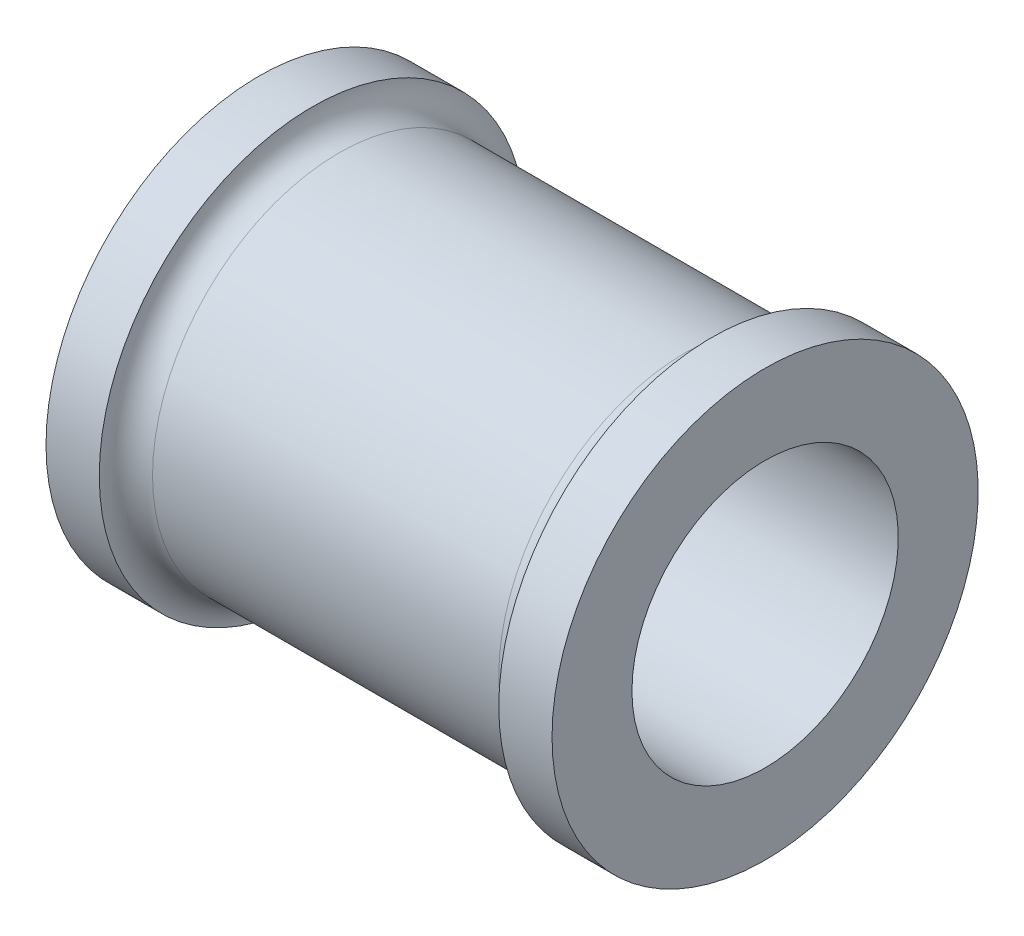
ISO-10303-21;
HEADER;
FILE_DESCRIPTION(('STEP AP214'),'2;1');
FILE_NAME('part.step','',(''),(''),'','','');
FILE_SCHEMA(('AUTOMOTIVE_DESIGN { 1 0 10303 214 1 1 1 1 }'));
ENDSEC;
DATA;
#1=APPLICATION_CONTEXT('core data for automotive mechanical design processes');
#2=APPLICATION_PROTOCOL_DEFINITION('international standard','automotive_design',2000,#1);
#3=PRODUCT_CONTEXT('',#1,'mechanical');
#4=PRODUCT('Part','Part','',(#3));
#5=PRODUCT_RELATED_PRODUCT_CATEGORY('part','',(#4));
#6=PRODUCT_DEFINITION_FORMATION('','',#4);
#7=PRODUCT_DEFINITION_CONTEXT('part definition',#1,'design');
#8=PRODUCT_DEFINITION('design','',#6,#7);
#9=PRODUCT_DEFINITION_SHAPE('','',#8);
#10=(LENGTH_UNIT() NAMED_UNIT(*) SI_UNIT(.MILLI.,.METRE.));
#11=(NAMED_UNIT(*) PLANE_ANGLE_UNIT() SI_UNIT($,.RADIAN.));
#12=(NAMED_UNIT(*) SI_UNIT($,.STERADIAN.) SOLID_ANGLE_UNIT());
#13=UNCERTAINTY_MEASURE_WITH_UNIT(LENGTH_MEASURE(1.E-05),#10,'distance_accuracy_value','');
#14=(GEOMETRIC_REPRESENTATION_CONTEXT(3) GLOBAL_UNCERTAINTY_ASSIGNED_CONTEXT((#13)) GLOBAL_UNIT_ASSIGNED_CONTEXT((#10,
#11,#12)) REPRESENTATION_CONTEXT('',''));
#15=CARTESIAN_POINT('',(0.,0.,0.));
#16=DIRECTION('',(0.,0.,1.));
#17=DIRECTION('',(1.,0.,0.));
#18=AXIS2_PLACEMENT_3D('',#15,#16,#17);
#19=CARTESIAN_POINT('',(0.,0.,0.));
#20=DIRECTION('',(-1.,0.,0.));
#21=DIRECTION('',(0.,0.,1.));
#22=AXIS2_PLACEMENT_3D('',#19,#20,#21);
#23=CYLINDRICAL_SURFACE('',#22,8.);
#24=CARTESIAN_POINT('',(-2.,0.,0.));
#25=DIRECTION('',(-1.,0.,0.));
#26=DIRECTION('',(0.,0.,1.));
#27=AXIS2_PLACEMENT_3D('',#24,#25,#26);
#28=CIRCLE('',#27,8.);
#29=CARTESIAN_POINT('',(-2.,0.,8.));
#30=VERTEX_POINT('',#29);
#31=EDGE_CURVE('E61',#30,#30,#28,.T.);
#32=ORIENTED_EDGE('',*,*,#31,.F.);
#33=EDGE_LOOP('',(#32));
#34=FACE_BOUND('',#33,.T.);
#35=CARTESIAN_POINT('',(0.,0.,0.));
#36=DIRECTION('',(-1.,0.,0.));
#37=DIRECTION('',(0.,0.,1.));
#38=AXIS2_PLACEMENT_3D('',#35,#36,#37);
#39=CIRCLE('',#38,8.);
#40=CARTESIAN_POINT('',(0.,0.,8.));
#41=VERTEX_POINT('',#40);
#42=EDGE_CURVE('E57',#41,#41,#39,.T.);
#43=ORIENTED_EDGE('',*,*,#42,.T.);
#44=EDGE_LOOP('',(#43));
#45=FACE_BOUND('',#44,.T.);
#46=ADVANCED_FACE('F46',(#34,#45),#23,.T.);
#47=CARTESIAN_POINT('',(-2.,0.,-5.));
#48=DIRECTION('',(1.,0.,0.));
#49=DIRECTION('',(0.,0.,-1.));
#50=AXIS2_PLACEMENT_3D('',#47,#48,#49);
#51=PLANE('',#50);
#52=CARTESIAN_POINT('',(-2.,0.,0.));
#53=DIRECTION('',(-1.,0.,0.));
#54=DIRECTION('',(0.,0.,1.));
#55=AXIS2_PLACEMENT_3D('',#52,#53,#54);
#56=CIRCLE('',#55,5.);
#57=CARTESIAN_POINT('',(-2.,0.,5.));
#58=VERTEX_POINT('',#57);
#59=EDGE_CURVE('E66',#58,#58,#56,.T.);
#60=ORIENTED_EDGE('',*,*,#59,.F.);
#61=EDGE_LOOP('',(#60));
#62=FACE_BOUND('',#61,.T.);
#63=ORIENTED_EDGE('',*,*,#31,.T.);
#64=EDGE_LOOP('',(#63));
#65=FACE_BOUND('',#64,.T.);
#66=ADVANCED_FACE('F97',(#62,#65),#51,.F.);
#67=CARTESIAN_POINT('',(0.,0.,0.));
#68=DIRECTION('',(-1.,0.,0.));
#69=DIRECTION('',(0.,0.,1.));
#70=AXIS2_PLACEMENT_3D('',#67,#68,#69);
#71=CYLINDRICAL_SURFACE('',#70,5.);
#72=CARTESIAN_POINT('',(17.,0.,0.));
#73=DIRECTION('',(-1.,0.,0.));
#74=DIRECTION('',(0.,0.,1.));
#75=AXIS2_PLACEMENT_3D('',#72,#73,#74);
#76=CIRCLE('',#75,5.);
#77=CARTESIAN_POINT('',(17.,0.,5.));
#78=VERTEX_POINT('',#77);
#79=EDGE_CURVE('E69',#78,#78,#76,.T.);
#80=ORIENTED_EDGE('',*,*,#79,.F.);
#81=EDGE_LOOP('',(#80));
#82=FACE_BOUND('',#81,.T.);
#83=ORIENTED_EDGE('',*,*,#59,.T.);
#84=EDGE_LOOP('',(#83));
#85=FACE_BOUND('',#84,.T.);
#86=ADVANCED_FACE('F91',(#82,#85),#71,.F.);
#87=CARTESIAN_POINT('',(17.,0.,-8.));
#88=DIRECTION('',(-1.,0.,0.));
#89=DIRECTION('',(0.,0.,1.));
#90=AXIS2_PLACEMENT_3D('',#87,#88,#89);
#91=PLANE('',#90);
#92=CARTESIAN_POINT('',(17.,0.,0.));
#93=DIRECTION('',(-1.,0.,0.));
#94=DIRECTION('',(0.,0.,1.));
#95=AXIS2_PLACEMENT_3D('',#92,#93,#94);
#96=CIRCLE('',#95,8.);
#97=CARTESIAN_POINT('',(17.,0.,8.));
#98=VERTEX_POINT('',#97);
#99=EDGE_CURVE('E72',#98,#98,#96,.T.);
#100=ORIENTED_EDGE('',*,*,#99,.F.);
#101=EDGE_LOOP('',(#100));
#102=FACE_BOUND('',#101,.T.);
#103=ORIENTED_EDGE('',*,*,#79,.T.);
#104=EDGE_LOOP('',(#103));
#105=FACE_BOUND('',#104,.T.);
#106=ADVANCED_FACE('F85',(#102,#105),#91,.F.);
#107=CARTESIAN_POINT('',(0.,0.,0.));
#108=DIRECTION('',(-1.,0.,0.));
#109=DIRECTION('',(0.,0.,1.));
#110=AXIS2_PLACEMENT_3D('',#107,#108,#109);
#111=CYLINDRICAL_SURFACE('',#110,8.);
#112=CARTESIAN_POINT('',(15.,0.,0.));
#113=DIRECTION('',(-1.,0.,0.));
#114=DIRECTION('',(0.,0.,1.));
#115=AXIS2_PLACEMENT_3D('',#112,#113,#114);
#116=CIRCLE('',#115,8.);
#117=CARTESIAN_POINT('',(15.,0.,8.));
#118=VERTEX_POINT('',#117);
#119=EDGE_CURVE('E75',#118,#118,#116,.T.);
#120=ORIENTED_EDGE('',*,*,#119,.F.);
#121=EDGE_LOOP('',(#120));
#122=FACE_BOUND('',#121,.T.);
#123=ORIENTED_EDGE('',*,*,#99,.T.);
#124=EDGE_LOOP('',(#123));
#125=FACE_BOUND('',#124,.T.);
#126=ADVANCED_FACE('F81',(#122,#125),#111,.T.);
#127=CARTESIAN_POINT('',(0.,0.,0.));
#128=DIRECTION('',(-1.,0.,0.));
#129=DIRECTION('',(0.,0.,1.));
#130=AXIS2_PLACEMENT_3D('',#127,#128,#129);
#131=CYLINDRICAL_SURFACE('',#130,7.);
#132=CARTESIAN_POINT('',(1.,0.,0.));
#133=DIRECTION('',(-1.,0.,0.));
#134=DIRECTION('',(0.,0.,1.));
#135=AXIS2_PLACEMENT_3D('',#132,#133,#134);
#136=CIRCLE('',#135,7.);
#137=CARTESIAN_POINT('',(1.,0.,7.));
#138=VERTEX_POINT('',#137);
#139=EDGE_CURVE('E12',#138,#138,#136,.F.);
#140=ORIENTED_EDGE('',*,*,#139,.T.);
#141=EDGE_LOOP('',(#140));
#142=FACE_BOUND('',#141,.T.);
#143=CARTESIAN_POINT('',(14.,0.,0.));
#144=DIRECTION('',(1.,0.,0.));
#145=DIRECTION('',(0.,0.,-1.));
#146=AXIS2_PLACEMENT_3D('',#143,#144,#145);
#147=CIRCLE('',#146,7.);
#148=CARTESIAN_POINT('',(14.,0.,-7.));
#149=VERTEX_POINT('',#148);
#150=EDGE_CURVE('E53',#149,#149,#147,.F.);
#151=ORIENTED_EDGE('',*,*,#150,.T.);
#152=EDGE_LOOP('',(#151));
#153=FACE_BOUND('',#152,.T.);
#154=ADVANCED_FACE('F84',(#142,#153),#131,.T.);
#155=CARTESIAN_POINT('',(1.,0.,0.));
#156=DIRECTION('',(-1.,0.,0.));
#157=DIRECTION('',(0.,0.,1.));
#158=AXIS2_PLACEMENT_3D('',#155,#156,#157);
#159=TOROIDAL_SURFACE('',#158,8.,1.);
#160=ORIENTED_EDGE('',*,*,#139,.F.);
#161=EDGE_LOOP('',(#160));
#162=FACE_BOUND('',#161,.T.);
#163=ORIENTED_EDGE('',*,*,#42,.F.);
#164=EDGE_LOOP('',(#163));
#165=FACE_BOUND('',#164,.T.);
#166=ADVANCED_FACE('F111',(#162,#165),#159,.F.);
#167=CARTESIAN_POINT('',(14.,0.,0.));
#168=DIRECTION('',(1.,0.,0.));
#169=DIRECTION('',(0.,0.,-1.));
#170=AXIS2_PLACEMENT_3D('',#167,#168,#169);
#171=TOROIDAL_SURFACE('',#170,8.,1.);
#172=ORIENTED_EDGE('',*,*,#119,.T.);
#173=EDGE_LOOP('',(#172));
#174=FACE_BOUND('',#173,.T.);
#175=ORIENTED_EDGE('',*,*,#150,.F.);
#176=EDGE_LOOP('',(#175));
#177=FACE_BOUND('',#176,.T.);
#178=ADVANCED_FACE('F48',(#174,#177),#171,.F.);
#179=CLOSED_SHELL('',(#46,#66,#86,#106,#126,#154,#166,#178));
#180=MANIFOLD_SOLID_BREP('B2',#179);
#181=ADVANCED_BREP_SHAPE_REPRESENTATION('',(#18,#180),#14);
#182=SHAPE_DEFINITION_REPRESENTATION(#9,#181);
ENDSEC;
END-ISO-10303-21;
